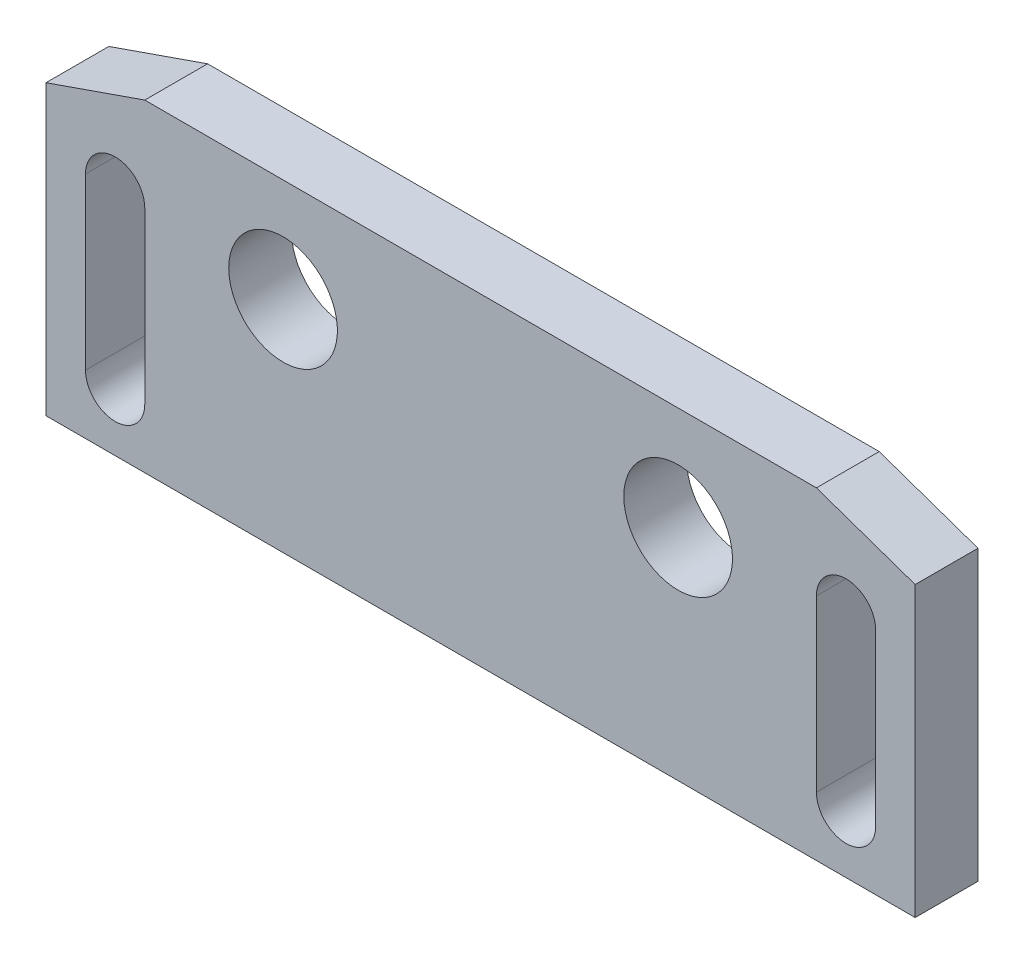
ISO-10303-21;
HEADER;
FILE_DESCRIPTION(('STEP AP214'),'2;1');
FILE_NAME('part.step','',(''),(''),'','','');
FILE_SCHEMA(('AUTOMOTIVE_DESIGN { 1 0 10303 214 1 1 1 1 }'));
ENDSEC;
DATA;
#1=APPLICATION_CONTEXT('core data for automotive mechanical design processes');
#2=APPLICATION_PROTOCOL_DEFINITION('international standard','automotive_design',2000,#1);
#3=PRODUCT_CONTEXT('',#1,'mechanical');
#4=PRODUCT('Part','Part','',(#3));
#5=PRODUCT_RELATED_PRODUCT_CATEGORY('part','',(#4));
#6=PRODUCT_DEFINITION_FORMATION('','',#4);
#7=PRODUCT_DEFINITION_CONTEXT('part definition',#1,'design');
#8=PRODUCT_DEFINITION('design','',#6,#7);
#9=PRODUCT_DEFINITION_SHAPE('','',#8);
#10=(LENGTH_UNIT() NAMED_UNIT(*) SI_UNIT(.MILLI.,.METRE.));
#11=(NAMED_UNIT(*) PLANE_ANGLE_UNIT() SI_UNIT($,.RADIAN.));
#12=(NAMED_UNIT(*) SI_UNIT($,.STERADIAN.) SOLID_ANGLE_UNIT());
#13=UNCERTAINTY_MEASURE_WITH_UNIT(LENGTH_MEASURE(1.E-05),#10,'distance_accuracy_value','');
#14=(GEOMETRIC_REPRESENTATION_CONTEXT(3) GLOBAL_UNCERTAINTY_ASSIGNED_CONTEXT((#13)) GLOBAL_UNIT_ASSIGNED_CONTEXT((#10,
#11,#12)) REPRESENTATION_CONTEXT('',''));
#15=CARTESIAN_POINT('',(0.,0.,0.));
#16=DIRECTION('',(0.,0.,1.));
#17=DIRECTION('',(1.,0.,0.));
#18=AXIS2_PLACEMENT_3D('',#15,#16,#17);
#19=CARTESIAN_POINT('',(0.,0.,3.18));
#20=DIRECTION('',(0.,0.,1.));
#21=DIRECTION('',(1.,0.,0.));
#22=AXIS2_PLACEMENT_3D('',#19,#20,#21);
#23=PLANE('',#22);
#24=CARTESIAN_POINT('',(10.,-15.,3.18));
#25=DIRECTION('',(0.,0.,1.));
#26=DIRECTION('',(1.,0.,0.));
#27=AXIS2_PLACEMENT_3D('',#24,#25,#26);
#28=CIRCLE('',#27,2.75000000000003);
#29=CARTESIAN_POINT('',(7.24999999999997,-15.,3.18));
#30=VERTEX_POINT('',#29);
#31=EDGE_CURVE('E163',#30,#30,#28,.T.);
#32=ORIENTED_EDGE('',*,*,#31,.F.);
#33=EDGE_LOOP('',(#32));
#34=FACE_BOUND('',#33,.T.);
#35=DIRECTION('',(0.,1.,0.));
#36=VECTOR('',#35,1.);
#37=CARTESIAN_POINT('',(-17.,-23.1016190139814,3.18));
#38=LINE('',#37,#36);
#39=CARTESIAN_POINT('',(-17.,-23.1016190139814,3.18));
#40=VERTEX_POINT('',#39);
#41=CARTESIAN_POINT('',(-17.,-14.4983809860214,3.18));
#42=VERTEX_POINT('',#41);
#43=EDGE_CURVE('E175',#40,#42,#38,.T.);
#44=ORIENTED_EDGE('',*,*,#43,.F.);
#45=CARTESIAN_POINT('',(-18.5,-23.1016190139814,3.18));
#46=DIRECTION('',(0.,0.,1.));
#47=DIRECTION('',(1.,0.,0.));
#48=AXIS2_PLACEMENT_3D('',#45,#46,#47);
#49=CIRCLE('',#48,1.5);
#50=CARTESIAN_POINT('',(-20.,-23.1016190139814,3.18));
#51=VERTEX_POINT('',#50);
#52=EDGE_CURVE('E173',#51,#40,#49,.T.);
#53=ORIENTED_EDGE('',*,*,#52,.F.);
#54=DIRECTION('',(0.,-1.,0.));
#55=VECTOR('',#54,1.);
#56=CARTESIAN_POINT('',(-20.,-23.1016190139814,3.18));
#57=LINE('',#56,#55);
#58=CARTESIAN_POINT('',(-20.,-14.4983809860214,3.18));
#59=VERTEX_POINT('',#58);
#60=EDGE_CURVE('E181',#59,#51,#57,.T.);
#61=ORIENTED_EDGE('',*,*,#60,.F.);
#62=CARTESIAN_POINT('',(-18.5,-14.4983809860214,3.18));
#63=DIRECTION('',(0.,0.,1.));
#64=DIRECTION('',(1.,0.,0.));
#65=AXIS2_PLACEMENT_3D('',#62,#63,#64);
#66=CIRCLE('',#65,1.5);
#67=EDGE_CURVE('E178',#42,#59,#66,.T.);
#68=ORIENTED_EDGE('',*,*,#67,.F.);
#69=EDGE_LOOP('',(#44,#53,#61,#68));
#70=FACE_BOUND('',#69,.T.);
#71=DIRECTION('',(-0.944537134510255,-0.328404630800416,0.));
#72=VECTOR('',#71,1.);
#73=CARTESIAN_POINT('',(-17.,-9.76155786362654,3.18));
#74=LINE('',#73,#72);
#75=CARTESIAN_POINT('',(-17.,-9.76155786362654,3.18));
#76=VERTEX_POINT('',#75);
#77=CARTESIAN_POINT('',(-22.,-11.5,3.18));
#78=VERTEX_POINT('',#77);
#79=EDGE_CURVE('E204',#76,#78,#74,.T.);
#80=ORIENTED_EDGE('',*,*,#79,.T.);
#81=DIRECTION('',(0.,-1.,0.));
#82=VECTOR('',#81,1.);
#83=CARTESIAN_POINT('',(-22.,-11.5,3.18));
#84=LINE('',#83,#82);
#85=CARTESIAN_POINT('',(-22.,-26.1016190139814,3.18));
#86=VERTEX_POINT('',#85);
#87=EDGE_CURVE('E207',#78,#86,#84,.T.);
#88=ORIENTED_EDGE('',*,*,#87,.T.);
#89=DIRECTION('',(1.,0.,0.));
#90=VECTOR('',#89,1.);
#91=CARTESIAN_POINT('',(-22.,-26.1016190139814,3.18));
#92=LINE('',#91,#90);
#93=CARTESIAN_POINT('',(22.,-26.1016190139814,3.18));
#94=VERTEX_POINT('',#93);
#95=EDGE_CURVE('E210',#86,#94,#92,.T.);
#96=ORIENTED_EDGE('',*,*,#95,.T.);
#97=DIRECTION('',(0.,1.,0.));
#98=VECTOR('',#97,1.);
#99=CARTESIAN_POINT('',(22.,-11.5,3.18));
#100=LINE('',#99,#98);
#101=CARTESIAN_POINT('',(22.,-11.5,3.18));
#102=VERTEX_POINT('',#101);
#103=EDGE_CURVE('E212',#94,#102,#100,.T.);
#104=ORIENTED_EDGE('',*,*,#103,.T.);
#105=DIRECTION('',(-0.944537134510254,0.328404630800418,0.));
#106=VECTOR('',#105,1.);
#107=CARTESIAN_POINT('',(17.,-9.76155786362654,3.18));
#108=LINE('',#107,#106);
#109=CARTESIAN_POINT('',(17.,-9.76155786362654,3.18));
#110=VERTEX_POINT('',#109);
#111=EDGE_CURVE('E214',#102,#110,#108,.T.);
#112=ORIENTED_EDGE('',*,*,#111,.T.);
#113=DIRECTION('',(-1.,0.,0.));
#114=VECTOR('',#113,1.);
#115=CARTESIAN_POINT('',(-17.,-9.76155786362654,3.18));
#116=LINE('',#115,#114);
#117=EDGE_CURVE('E216',#110,#76,#116,.T.);
#118=ORIENTED_EDGE('',*,*,#117,.T.);
#119=EDGE_LOOP('',(#80,#88,#96,#104,#112,#118));
#120=FACE_BOUND('',#119,.T.);
#121=DIRECTION('',(0.,1.,0.));
#122=VECTOR('',#121,1.);
#123=CARTESIAN_POINT('',(20.,-23.1016190139814,3.18));
#124=LINE('',#123,#122);
#125=CARTESIAN_POINT('',(20.,-23.1016190139814,3.18));
#126=VERTEX_POINT('',#125);
#127=CARTESIAN_POINT('',(20.,-14.4983809860214,3.18));
#128=VERTEX_POINT('',#127);
#129=EDGE_CURVE('E142',#126,#128,#124,.T.);
#130=ORIENTED_EDGE('',*,*,#129,.F.);
#131=CARTESIAN_POINT('',(18.5,-23.1016190139814,3.18));
#132=DIRECTION('',(0.,0.,1.));
#133=DIRECTION('',(-1.,0.,0.));
#134=AXIS2_PLACEMENT_3D('',#131,#132,#133);
#135=CIRCLE('',#134,1.5);
#136=CARTESIAN_POINT('',(17.,-23.1016190139814,3.18));
#137=VERTEX_POINT('',#136);
#138=EDGE_CURVE('E134',#137,#126,#135,.T.);
#139=ORIENTED_EDGE('',*,*,#138,.F.);
#140=DIRECTION('',(0.,-1.,0.));
#141=VECTOR('',#140,1.);
#142=CARTESIAN_POINT('',(17.,-23.1016190139814,3.18));
#143=LINE('',#142,#141);
#144=CARTESIAN_POINT('',(17.,-14.4983809860214,3.18));
#145=VERTEX_POINT('',#144);
#146=EDGE_CURVE('E157',#145,#137,#143,.T.);
#147=ORIENTED_EDGE('',*,*,#146,.F.);
#148=CARTESIAN_POINT('',(18.5,-14.4983809860214,3.18));
#149=DIRECTION('',(0.,0.,1.));
#150=DIRECTION('',(-1.,0.,0.));
#151=AXIS2_PLACEMENT_3D('',#148,#149,#150);
#152=CIRCLE('',#151,1.5);
#153=EDGE_CURVE('E155',#128,#145,#152,.T.);
#154=ORIENTED_EDGE('',*,*,#153,.F.);
#155=EDGE_LOOP('',(#130,#139,#147,#154));
#156=FACE_BOUND('',#155,.T.);
#157=CARTESIAN_POINT('',(-10.,-15.,3.18));
#158=DIRECTION('',(0.,0.,1.));
#159=DIRECTION('',(1.,0.,0.));
#160=AXIS2_PLACEMENT_3D('',#157,#158,#159);
#161=CIRCLE('',#160,2.75000000000003);
#162=CARTESIAN_POINT('',(-12.75,-15.,3.18));
#163=VERTEX_POINT('',#162);
#164=EDGE_CURVE('E328',#163,#163,#161,.T.);
#165=ORIENTED_EDGE('',*,*,#164,.F.);
#166=EDGE_LOOP('',(#165));
#167=FACE_BOUND('',#166,.T.);
#168=ADVANCED_FACE('F33',(#34,#70,#120,#156,#167),#23,.T.);
#169=CARTESIAN_POINT('',(0.,0.,0.));
#170=DIRECTION('',(0.,0.,1.));
#171=DIRECTION('',(1.,0.,0.));
#172=AXIS2_PLACEMENT_3D('',#169,#170,#171);
#173=PLANE('',#172);
#174=CARTESIAN_POINT('',(10.,-15.,0.));
#175=DIRECTION('',(0.,0.,1.));
#176=DIRECTION('',(1.,0.,0.));
#177=AXIS2_PLACEMENT_3D('',#174,#175,#176);
#178=CIRCLE('',#177,2.75000000000003);
#179=CARTESIAN_POINT('',(7.24999999999997,-15.,0.));
#180=VERTEX_POINT('',#179);
#181=EDGE_CURVE('E334',#180,#180,#178,.T.);
#182=ORIENTED_EDGE('',*,*,#181,.T.);
#183=EDGE_LOOP('',(#182));
#184=FACE_BOUND('',#183,.T.);
#185=CARTESIAN_POINT('',(-18.5,-23.1016190139814,0.));
#186=DIRECTION('',(0.,0.,1.));
#187=DIRECTION('',(1.,0.,0.));
#188=AXIS2_PLACEMENT_3D('',#185,#186,#187);
#189=CIRCLE('',#188,1.5);
#190=CARTESIAN_POINT('',(-20.,-23.1016190139814,0.));
#191=VERTEX_POINT('',#190);
#192=CARTESIAN_POINT('',(-17.,-23.1016190139814,0.));
#193=VERTEX_POINT('',#192);
#194=EDGE_CURVE('E150',#191,#193,#189,.T.);
#195=ORIENTED_EDGE('',*,*,#194,.T.);
#196=DIRECTION('',(0.,1.,0.));
#197=VECTOR('',#196,1.);
#198=CARTESIAN_POINT('',(-17.,-23.1016190139814,0.));
#199=LINE('',#198,#197);
#200=CARTESIAN_POINT('',(-17.,-14.4983809860214,0.));
#201=VERTEX_POINT('',#200);
#202=EDGE_CURVE('E186',#193,#201,#199,.T.);
#203=ORIENTED_EDGE('',*,*,#202,.T.);
#204=CARTESIAN_POINT('',(-18.5,-14.4983809860214,0.));
#205=DIRECTION('',(0.,0.,1.));
#206=DIRECTION('',(1.,0.,0.));
#207=AXIS2_PLACEMENT_3D('',#204,#205,#206);
#208=CIRCLE('',#207,1.5);
#209=CARTESIAN_POINT('',(-20.,-14.4983809860214,0.));
#210=VERTEX_POINT('',#209);
#211=EDGE_CURVE('E189',#201,#210,#208,.T.);
#212=ORIENTED_EDGE('',*,*,#211,.T.);
#213=DIRECTION('',(0.,-1.,0.));
#214=VECTOR('',#213,1.);
#215=CARTESIAN_POINT('',(-20.,-23.1016190139814,0.));
#216=LINE('',#215,#214);
#217=EDGE_CURVE('E176',#210,#191,#216,.T.);
#218=ORIENTED_EDGE('',*,*,#217,.T.);
#219=EDGE_LOOP('',(#195,#203,#212,#218));
#220=FACE_BOUND('',#219,.T.);
#221=DIRECTION('',(-0.944537134510255,-0.328404630800416,0.));
#222=VECTOR('',#221,1.);
#223=CARTESIAN_POINT('',(-17.,-9.76155786362654,0.));
#224=LINE('',#223,#222);
#225=CARTESIAN_POINT('',(-17.,-9.76155786362654,0.));
#226=VERTEX_POINT('',#225);
#227=CARTESIAN_POINT('',(-22.,-11.5,0.));
#228=VERTEX_POINT('',#227);
#229=EDGE_CURVE('E203',#226,#228,#224,.T.);
#230=ORIENTED_EDGE('',*,*,#229,.F.);
#231=DIRECTION('',(-1.,0.,0.));
#232=VECTOR('',#231,1.);
#233=CARTESIAN_POINT('',(-17.,-9.76155786362654,0.));
#234=LINE('',#233,#232);
#235=CARTESIAN_POINT('',(17.,-9.76155786362654,0.));
#236=VERTEX_POINT('',#235);
#237=EDGE_CURVE('E208',#236,#226,#234,.T.);
#238=ORIENTED_EDGE('',*,*,#237,.F.);
#239=DIRECTION('',(-0.944537134510254,0.328404630800418,0.));
#240=VECTOR('',#239,1.);
#241=CARTESIAN_POINT('',(17.,-9.76155786362654,0.));
#242=LINE('',#241,#240);
#243=CARTESIAN_POINT('',(22.,-11.5,0.));
#244=VERTEX_POINT('',#243);
#245=EDGE_CURVE('E227',#244,#236,#242,.T.);
#246=ORIENTED_EDGE('',*,*,#245,.F.);
#247=DIRECTION('',(0.,1.,0.));
#248=VECTOR('',#247,1.);
#249=CARTESIAN_POINT('',(22.,-11.5,0.));
#250=LINE('',#249,#248);
#251=CARTESIAN_POINT('',(22.,-26.1016190139814,0.));
#252=VERTEX_POINT('',#251);
#253=EDGE_CURVE('E225',#252,#244,#250,.T.);
#254=ORIENTED_EDGE('',*,*,#253,.F.);
#255=DIRECTION('',(1.,0.,0.));
#256=VECTOR('',#255,1.);
#257=CARTESIAN_POINT('',(-22.,-26.1016190139814,0.));
#258=LINE('',#257,#256);
#259=CARTESIAN_POINT('',(-22.,-26.1016190139814,0.));
#260=VERTEX_POINT('',#259);
#261=EDGE_CURVE('E223',#260,#252,#258,.T.);
#262=ORIENTED_EDGE('',*,*,#261,.F.);
#263=DIRECTION('',(0.,-1.,0.));
#264=VECTOR('',#263,1.);
#265=CARTESIAN_POINT('',(-22.,-11.5,0.));
#266=LINE('',#265,#264);
#267=EDGE_CURVE('E221',#228,#260,#266,.T.);
#268=ORIENTED_EDGE('',*,*,#267,.F.);
#269=EDGE_LOOP('',(#230,#238,#246,#254,#262,#268));
#270=FACE_BOUND('',#269,.T.);
#271=CARTESIAN_POINT('',(18.5,-23.1016190139814,0.));
#272=DIRECTION('',(0.,0.,1.));
#273=DIRECTION('',(-1.,0.,0.));
#274=AXIS2_PLACEMENT_3D('',#271,#272,#273);
#275=CIRCLE('',#274,1.5);
#276=CARTESIAN_POINT('',(17.,-23.1016190139814,0.));
#277=VERTEX_POINT('',#276);
#278=CARTESIAN_POINT('',(20.,-23.1016190139814,0.));
#279=VERTEX_POINT('',#278);
#280=EDGE_CURVE('E56',#277,#279,#275,.T.);
#281=ORIENTED_EDGE('',*,*,#280,.T.);
#282=DIRECTION('',(0.,1.,0.));
#283=VECTOR('',#282,1.);
#284=CARTESIAN_POINT('',(20.,-23.1016190139814,0.));
#285=LINE('',#284,#283);
#286=CARTESIAN_POINT('',(20.,-14.4983809860214,0.));
#287=VERTEX_POINT('',#286);
#288=EDGE_CURVE('E149',#279,#287,#285,.T.);
#289=ORIENTED_EDGE('',*,*,#288,.T.);
#290=CARTESIAN_POINT('',(18.5,-14.4983809860214,0.));
#291=DIRECTION('',(0.,0.,1.));
#292=DIRECTION('',(-1.,0.,0.));
#293=AXIS2_PLACEMENT_3D('',#290,#291,#292);
#294=CIRCLE('',#293,1.5);
#295=CARTESIAN_POINT('',(17.,-14.4983809860214,0.));
#296=VERTEX_POINT('',#295);
#297=EDGE_CURVE('E165',#287,#296,#294,.T.);
#298=ORIENTED_EDGE('',*,*,#297,.T.);
#299=DIRECTION('',(0.,-1.,0.));
#300=VECTOR('',#299,1.);
#301=CARTESIAN_POINT('',(17.,-23.1016190139814,0.));
#302=LINE('',#301,#300);
#303=EDGE_CURVE('E143',#296,#277,#302,.T.);
#304=ORIENTED_EDGE('',*,*,#303,.T.);
#305=EDGE_LOOP('',(#281,#289,#298,#304));
#306=FACE_BOUND('',#305,.T.);
#307=CARTESIAN_POINT('',(-10.,-15.,0.));
#308=DIRECTION('',(0.,0.,1.));
#309=DIRECTION('',(1.,0.,0.));
#310=AXIS2_PLACEMENT_3D('',#307,#308,#309);
#311=CIRCLE('',#310,2.75000000000003);
#312=CARTESIAN_POINT('',(-12.75,-15.,0.));
#313=VERTEX_POINT('',#312);
#314=EDGE_CURVE('E331',#313,#313,#311,.T.);
#315=ORIENTED_EDGE('',*,*,#314,.T.);
#316=EDGE_LOOP('',(#315));
#317=FACE_BOUND('',#316,.T.);
#318=ADVANCED_FACE('F251',(#184,#220,#270,#306,#317),#173,.F.);
#319=CARTESIAN_POINT('',(-17.,-9.76155786362654,3.18));
#320=DIRECTION('',(0.328404630800416,-0.944537134510254,0.));
#321=DIRECTION('',(0.944537134510255,0.328404630800416,0.));
#322=AXIS2_PLACEMENT_3D('',#319,#320,#321);
#323=PLANE('',#322);
#324=ORIENTED_EDGE('',*,*,#229,.T.);
#325=DIRECTION('',(0.,0.,-1.));
#326=VECTOR('',#325,1.);
#327=CARTESIAN_POINT('',(-22.,-11.5,3.18));
#328=LINE('',#327,#326);
#329=EDGE_CURVE('E11',#78,#228,#328,.T.);
#330=ORIENTED_EDGE('',*,*,#329,.F.);
#331=ORIENTED_EDGE('',*,*,#79,.F.);
#332=DIRECTION('',(0.,0.,-1.));
#333=VECTOR('',#332,1.);
#334=CARTESIAN_POINT('',(-17.,-9.76155786362654,3.18));
#335=LINE('',#334,#333);
#336=EDGE_CURVE('E218',#76,#226,#335,.T.);
#337=ORIENTED_EDGE('',*,*,#336,.T.);
#338=EDGE_LOOP('',(#324,#330,#331,#337));
#339=FACE_BOUND('',#338,.T.);
#340=ADVANCED_FACE('F35',(#339),#323,.F.);
#341=CARTESIAN_POINT('',(-22.,-11.5,3.18));
#342=DIRECTION('',(1.,0.,0.));
#343=DIRECTION('',(0.,0.,-1.));
#344=AXIS2_PLACEMENT_3D('',#341,#342,#343);
#345=PLANE('',#344);
#346=ORIENTED_EDGE('',*,*,#267,.T.);
#347=DIRECTION('',(0.,0.,-1.));
#348=VECTOR('',#347,1.);
#349=CARTESIAN_POINT('',(-22.,-26.1016190139814,3.18));
#350=LINE('',#349,#348);
#351=EDGE_CURVE('E41',#86,#260,#350,.T.);
#352=ORIENTED_EDGE('',*,*,#351,.F.);
#353=ORIENTED_EDGE('',*,*,#87,.F.);
#354=ORIENTED_EDGE('',*,*,#329,.T.);
#355=EDGE_LOOP('',(#346,#352,#353,#354));
#356=FACE_BOUND('',#355,.T.);
#357=ADVANCED_FACE('F268',(#356),#345,.F.);
#358=CARTESIAN_POINT('',(-22.,-26.1016190139814,3.18));
#359=DIRECTION('',(0.,1.,0.));
#360=DIRECTION('',(-1.,0.,0.));
#361=AXIS2_PLACEMENT_3D('',#358,#359,#360);
#362=PLANE('',#361);
#363=ORIENTED_EDGE('',*,*,#261,.T.);
#364=DIRECTION('',(0.,0.,-1.));
#365=VECTOR('',#364,1.);
#366=CARTESIAN_POINT('',(22.,-26.1016190139814,3.18));
#367=LINE('',#366,#365);
#368=EDGE_CURVE('E238',#94,#252,#367,.T.);
#369=ORIENTED_EDGE('',*,*,#368,.F.);
#370=ORIENTED_EDGE('',*,*,#95,.F.);
#371=ORIENTED_EDGE('',*,*,#351,.T.);
#372=EDGE_LOOP('',(#363,#369,#370,#371));
#373=FACE_BOUND('',#372,.T.);
#374=ADVANCED_FACE('F245',(#373),#362,.F.);
#375=CARTESIAN_POINT('',(22.,-11.5,3.18));
#376=DIRECTION('',(-1.,0.,0.));
#377=DIRECTION('',(0.,-1.,0.));
#378=AXIS2_PLACEMENT_3D('',#375,#376,#377);
#379=PLANE('',#378);
#380=ORIENTED_EDGE('',*,*,#253,.T.);
#381=DIRECTION('',(0.,0.,-1.));
#382=VECTOR('',#381,1.);
#383=CARTESIAN_POINT('',(22.,-11.5,3.18));
#384=LINE('',#383,#382);
#385=EDGE_CURVE('E235',#102,#244,#384,.T.);
#386=ORIENTED_EDGE('',*,*,#385,.F.);
#387=ORIENTED_EDGE('',*,*,#103,.F.);
#388=ORIENTED_EDGE('',*,*,#368,.T.);
#389=EDGE_LOOP('',(#380,#386,#387,#388));
#390=FACE_BOUND('',#389,.T.);
#391=ADVANCED_FACE('F257',(#390),#379,.F.);
#392=CARTESIAN_POINT('',(17.,-9.76155786362654,3.18));
#393=DIRECTION('',(-0.328404630800418,-0.944537134510254,0.));
#394=DIRECTION('',(0.944537134510254,-0.328404630800418,0.));
#395=AXIS2_PLACEMENT_3D('',#392,#393,#394);
#396=PLANE('',#395);
#397=ORIENTED_EDGE('',*,*,#245,.T.);
#398=DIRECTION('',(0.,0.,-1.));
#399=VECTOR('',#398,1.);
#400=CARTESIAN_POINT('',(17.,-9.76155786362654,3.18));
#401=LINE('',#400,#399);
#402=EDGE_CURVE('E232',#110,#236,#401,.T.);
#403=ORIENTED_EDGE('',*,*,#402,.F.);
#404=ORIENTED_EDGE('',*,*,#111,.F.);
#405=ORIENTED_EDGE('',*,*,#385,.T.);
#406=EDGE_LOOP('',(#397,#403,#404,#405));
#407=FACE_BOUND('',#406,.T.);
#408=ADVANCED_FACE('F261',(#407),#396,.F.);
#409=CARTESIAN_POINT('',(-17.,-9.76155786362654,3.18));
#410=DIRECTION('',(0.,-1.,0.));
#411=DIRECTION('',(0.,0.,-1.));
#412=AXIS2_PLACEMENT_3D('',#409,#410,#411);
#413=PLANE('',#412);
#414=ORIENTED_EDGE('',*,*,#237,.T.);
#415=ORIENTED_EDGE('',*,*,#336,.F.);
#416=ORIENTED_EDGE('',*,*,#117,.F.);
#417=ORIENTED_EDGE('',*,*,#402,.T.);
#418=EDGE_LOOP('',(#414,#415,#416,#417));
#419=FACE_BOUND('',#418,.T.);
#420=ADVANCED_FACE('F271',(#419),#413,.F.);
#421=CARTESIAN_POINT('',(-18.5,-23.1016190139814,3.18));
#422=DIRECTION('',(0.,0.,-1.));
#423=DIRECTION('',(-1.,0.,0.));
#424=AXIS2_PLACEMENT_3D('',#421,#422,#423);
#425=CYLINDRICAL_SURFACE('',#424,1.5);
#426=ORIENTED_EDGE('',*,*,#194,.F.);
#427=DIRECTION('',(0.,0.,-1.));
#428=VECTOR('',#427,1.);
#429=CARTESIAN_POINT('',(-20.,-23.1016190139814,3.18));
#430=LINE('',#429,#428);
#431=EDGE_CURVE('E183',#51,#191,#430,.T.);
#432=ORIENTED_EDGE('',*,*,#431,.F.);
#433=ORIENTED_EDGE('',*,*,#52,.T.);
#434=DIRECTION('',(0.,0.,-1.));
#435=VECTOR('',#434,1.);
#436=CARTESIAN_POINT('',(-17.,-23.1016190139814,3.18));
#437=LINE('',#436,#435);
#438=EDGE_CURVE('E200',#40,#193,#437,.T.);
#439=ORIENTED_EDGE('',*,*,#438,.T.);
#440=EDGE_LOOP('',(#426,#432,#433,#439));
#441=FACE_BOUND('',#440,.T.);
#442=ADVANCED_FACE('F273',(#441),#425,.F.);
#443=CARTESIAN_POINT('',(-17.,-23.1016190139814,3.18));
#444=DIRECTION('',(-1.,0.,0.));
#445=DIRECTION('',(0.,-1.,0.));
#446=AXIS2_PLACEMENT_3D('',#443,#444,#445);
#447=PLANE('',#446);
#448=ORIENTED_EDGE('',*,*,#202,.F.);
#449=ORIENTED_EDGE('',*,*,#438,.F.);
#450=ORIENTED_EDGE('',*,*,#43,.T.);
#451=DIRECTION('',(0.,0.,-1.));
#452=VECTOR('',#451,1.);
#453=CARTESIAN_POINT('',(-17.,-14.4983809860214,3.18));
#454=LINE('',#453,#452);
#455=EDGE_CURVE('E198',#42,#201,#454,.T.);
#456=ORIENTED_EDGE('',*,*,#455,.T.);
#457=EDGE_LOOP('',(#448,#449,#450,#456));
#458=FACE_BOUND('',#457,.T.);
#459=ADVANCED_FACE('F279',(#458),#447,.T.);
#460=CARTESIAN_POINT('',(-18.5,-14.4983809860214,3.18));
#461=DIRECTION('',(0.,0.,-1.));
#462=DIRECTION('',(-1.,0.,0.));
#463=AXIS2_PLACEMENT_3D('',#460,#461,#462);
#464=CYLINDRICAL_SURFACE('',#463,1.5);
#465=ORIENTED_EDGE('',*,*,#211,.F.);
#466=ORIENTED_EDGE('',*,*,#455,.F.);
#467=ORIENTED_EDGE('',*,*,#67,.T.);
#468=DIRECTION('',(0.,0.,-1.));
#469=VECTOR('',#468,1.);
#470=CARTESIAN_POINT('',(-20.,-14.4983809860214,3.18));
#471=LINE('',#470,#469);
#472=EDGE_CURVE('E196',#59,#210,#471,.T.);
#473=ORIENTED_EDGE('',*,*,#472,.T.);
#474=EDGE_LOOP('',(#465,#466,#467,#473));
#475=FACE_BOUND('',#474,.T.);
#476=ADVANCED_FACE('F296',(#475),#464,.F.);
#477=CARTESIAN_POINT('',(-20.,-23.1016190139814,3.18));
#478=DIRECTION('',(1.,0.,0.));
#479=DIRECTION('',(0.,0.,-1.));
#480=AXIS2_PLACEMENT_3D('',#477,#478,#479);
#481=PLANE('',#480);
#482=ORIENTED_EDGE('',*,*,#217,.F.);
#483=ORIENTED_EDGE('',*,*,#472,.F.);
#484=ORIENTED_EDGE('',*,*,#60,.T.);
#485=ORIENTED_EDGE('',*,*,#431,.T.);
#486=EDGE_LOOP('',(#482,#483,#484,#485));
#487=FACE_BOUND('',#486,.T.);
#488=ADVANCED_FACE('F300',(#487),#481,.T.);
#489=CARTESIAN_POINT('',(18.5,-23.1016190139814,3.18));
#490=DIRECTION('',(0.,0.,-1.));
#491=DIRECTION('',(-1.,0.,0.));
#492=AXIS2_PLACEMENT_3D('',#489,#490,#491);
#493=CYLINDRICAL_SURFACE('',#492,1.5);
#494=ORIENTED_EDGE('',*,*,#280,.F.);
#495=DIRECTION('',(0.,0.,-1.));
#496=VECTOR('',#495,1.);
#497=CARTESIAN_POINT('',(17.,-23.1016190139814,3.18));
#498=LINE('',#497,#496);
#499=EDGE_CURVE('E138',#137,#277,#498,.T.);
#500=ORIENTED_EDGE('',*,*,#499,.F.);
#501=ORIENTED_EDGE('',*,*,#138,.T.);
#502=DIRECTION('',(0.,0.,-1.));
#503=VECTOR('',#502,1.);
#504=CARTESIAN_POINT('',(20.,-23.1016190139814,3.18));
#505=LINE('',#504,#503);
#506=EDGE_CURVE('E137',#126,#279,#505,.T.);
#507=ORIENTED_EDGE('',*,*,#506,.T.);
#508=EDGE_LOOP('',(#494,#500,#501,#507));
#509=FACE_BOUND('',#508,.T.);
#510=ADVANCED_FACE('F136',(#509),#493,.F.);
#511=CARTESIAN_POINT('',(20.,-23.1016190139814,3.18));
#512=DIRECTION('',(-1.,0.,0.));
#513=DIRECTION('',(0.,-1.,0.));
#514=AXIS2_PLACEMENT_3D('',#511,#512,#513);
#515=PLANE('',#514);
#516=ORIENTED_EDGE('',*,*,#288,.F.);
#517=ORIENTED_EDGE('',*,*,#506,.F.);
#518=ORIENTED_EDGE('',*,*,#129,.T.);
#519=DIRECTION('',(0.,0.,-1.));
#520=VECTOR('',#519,1.);
#521=CARTESIAN_POINT('',(20.,-14.4983809860214,3.18));
#522=LINE('',#521,#520);
#523=EDGE_CURVE('E151',#128,#287,#522,.T.);
#524=ORIENTED_EDGE('',*,*,#523,.T.);
#525=EDGE_LOOP('',(#516,#517,#518,#524));
#526=FACE_BOUND('',#525,.T.);
#527=ADVANCED_FACE('F146',(#526),#515,.T.);
#528=CARTESIAN_POINT('',(18.5,-14.4983809860214,3.18));
#529=DIRECTION('',(0.,0.,-1.));
#530=DIRECTION('',(-1.,0.,0.));
#531=AXIS2_PLACEMENT_3D('',#528,#529,#530);
#532=CYLINDRICAL_SURFACE('',#531,1.5);
#533=ORIENTED_EDGE('',*,*,#297,.F.);
#534=ORIENTED_EDGE('',*,*,#523,.F.);
#535=ORIENTED_EDGE('',*,*,#153,.T.);
#536=DIRECTION('',(0.,0.,-1.));
#537=VECTOR('',#536,1.);
#538=CARTESIAN_POINT('',(17.,-14.4983809860214,3.18));
#539=LINE('',#538,#537);
#540=EDGE_CURVE('E48',#145,#296,#539,.T.);
#541=ORIENTED_EDGE('',*,*,#540,.T.);
#542=EDGE_LOOP('',(#533,#534,#535,#541));
#543=FACE_BOUND('',#542,.T.);
#544=ADVANCED_FACE('F309',(#543),#532,.F.);
#545=CARTESIAN_POINT('',(17.,-23.1016190139814,3.18));
#546=DIRECTION('',(1.,0.,0.));
#547=DIRECTION('',(0.,1.,0.));
#548=AXIS2_PLACEMENT_3D('',#545,#546,#547);
#549=PLANE('',#548);
#550=ORIENTED_EDGE('',*,*,#303,.F.);
#551=ORIENTED_EDGE('',*,*,#540,.F.);
#552=ORIENTED_EDGE('',*,*,#146,.T.);
#553=ORIENTED_EDGE('',*,*,#499,.T.);
#554=EDGE_LOOP('',(#550,#551,#552,#553));
#555=FACE_BOUND('',#554,.T.);
#556=ADVANCED_FACE('F312',(#555),#549,.T.);
#557=CARTESIAN_POINT('',(10.,-15.,3.18));
#558=DIRECTION('',(0.,0.,-1.));
#559=DIRECTION('',(-1.,0.,0.));
#560=AXIS2_PLACEMENT_3D('',#557,#558,#559);
#561=CYLINDRICAL_SURFACE('',#560,2.75000000000003);
#562=CARTESIAN_POINT('',(7.24999999999997,-15.,3.18));
#563=CARTESIAN_POINT('',(7.24999999999997,-15.,3.146875));
#564=CARTESIAN_POINT('',(7.24999999999997,-15.,3.11375));
#565=CARTESIAN_POINT('',(7.24999999999997,-15.,3.0475));
#566=CARTESIAN_POINT('',(7.24999999999997,-15.,3.014375));
#567=CARTESIAN_POINT('',(7.24999999999997,-15.,2.948125));
#568=CARTESIAN_POINT('',(7.24999999999997,-15.,2.915));
#569=CARTESIAN_POINT('',(7.24999999999997,-15.,2.84875));
#570=CARTESIAN_POINT('',(7.24999999999997,-15.,2.815625));
#571=CARTESIAN_POINT('',(7.24999999999997,-15.,2.749375));
#572=CARTESIAN_POINT('',(7.24999999999997,-15.,2.71625));
#573=CARTESIAN_POINT('',(7.24999999999997,-15.,2.65));
#574=CARTESIAN_POINT('',(7.24999999999997,-15.,2.616875));
#575=CARTESIAN_POINT('',(7.24999999999997,-15.,2.550625));
#576=CARTESIAN_POINT('',(7.24999999999997,-15.,2.5175));
#577=CARTESIAN_POINT('',(7.24999999999997,-15.,2.45125));
#578=CARTESIAN_POINT('',(7.24999999999997,-15.,2.418125));
#579=CARTESIAN_POINT('',(7.24999999999997,-15.,2.351875));
#580=CARTESIAN_POINT('',(7.24999999999997,-15.,2.31875));
#581=CARTESIAN_POINT('',(7.24999999999997,-15.,2.2525));
#582=CARTESIAN_POINT('',(7.24999999999997,-15.,2.219375));
#583=CARTESIAN_POINT('',(7.24999999999997,-15.,2.153125));
#584=CARTESIAN_POINT('',(7.24999999999997,-15.,2.12));
#585=CARTESIAN_POINT('',(7.24999999999997,-15.,2.05375));
#586=CARTESIAN_POINT('',(7.24999999999997,-15.,2.020625));
#587=CARTESIAN_POINT('',(7.24999999999997,-15.,1.954375));
#588=CARTESIAN_POINT('',(7.24999999999997,-15.,1.92125));
#589=CARTESIAN_POINT('',(7.24999999999997,-15.,1.855));
#590=CARTESIAN_POINT('',(7.24999999999997,-15.,1.821875));
#591=CARTESIAN_POINT('',(7.24999999999997,-15.,1.755625));
#592=CARTESIAN_POINT('',(7.24999999999997,-15.,1.7225));
#593=CARTESIAN_POINT('',(7.24999999999997,-15.,1.65625));
#594=CARTESIAN_POINT('',(7.24999999999997,-15.,1.623125));
#595=CARTESIAN_POINT('',(7.24999999999997,-15.,1.556875));
#596=CARTESIAN_POINT('',(7.24999999999997,-15.,1.52375));
#597=CARTESIAN_POINT('',(7.24999999999997,-15.,1.4575));
#598=CARTESIAN_POINT('',(7.24999999999997,-15.,1.424375));
#599=CARTESIAN_POINT('',(7.24999999999997,-15.,1.358125));
#600=CARTESIAN_POINT('',(7.24999999999997,-15.,1.325));
#601=CARTESIAN_POINT('',(7.24999999999997,-15.,1.25875));
#602=CARTESIAN_POINT('',(7.24999999999997,-15.,1.225625));
#603=CARTESIAN_POINT('',(7.24999999999997,-15.,1.159375));
#604=CARTESIAN_POINT('',(7.24999999999997,-15.,1.12625));
#605=CARTESIAN_POINT('',(7.24999999999997,-15.,1.06));
#606=CARTESIAN_POINT('',(7.24999999999997,-15.,1.026875));
#607=CARTESIAN_POINT('',(7.24999999999997,-15.,0.960625));
#608=CARTESIAN_POINT('',(7.24999999999997,-15.,0.9275));
#609=CARTESIAN_POINT('',(7.24999999999997,-15.,0.86125));
#610=CARTESIAN_POINT('',(7.24999999999997,-15.,0.828125));
#611=CARTESIAN_POINT('',(7.24999999999997,-15.,0.761875));
#612=CARTESIAN_POINT('',(7.24999999999997,-15.,0.72875));
#613=CARTESIAN_POINT('',(7.24999999999997,-15.,0.6625));
#614=CARTESIAN_POINT('',(7.24999999999997,-15.,0.629375));
#615=CARTESIAN_POINT('',(7.24999999999997,-15.,0.563125));
#616=CARTESIAN_POINT('',(7.24999999999997,-15.,0.53));
#617=CARTESIAN_POINT('',(7.24999999999997,-15.,0.46375));
#618=CARTESIAN_POINT('',(7.24999999999997,-15.,0.430625));
#619=CARTESIAN_POINT('',(7.24999999999997,-15.,0.364375));
#620=CARTESIAN_POINT('',(7.24999999999997,-15.,0.33125));
#621=CARTESIAN_POINT('',(7.24999999999997,-15.,0.265));
#622=CARTESIAN_POINT('',(7.24999999999997,-15.,0.231875));
#623=CARTESIAN_POINT('',(7.24999999999997,-15.,0.165625));
#624=CARTESIAN_POINT('',(7.24999999999997,-15.,0.1325));
#625=CARTESIAN_POINT('',(7.24999999999997,-15.,0.06625));
#626=CARTESIAN_POINT('',(7.24999999999997,-15.,0.033125));
#627=CARTESIAN_POINT('',(7.24999999999997,-15.,0.));
#628=B_SPLINE_CURVE_WITH_KNOTS('',3,(#562,#563,#564,#565,#566,#567,#568,#569,#570,#571,#572,
#573,#574,#575,#576,#577,#578,#579,#580,#581,#582,#583,#584,#585,#586,#587,#588,#589,#590,#591,
#592,#593,#594,#595,#596,#597,#598,#599,#600,#601,#602,#603,#604,#605,#606,#607,#608,#609,#610,
#611,#612,#613,#614,#615,#616,#617,#618,#619,#620,#621,#622,#623,#624,#625,#626,#627),
.UNSPECIFIED.,.F.,.F.,(4,2,2,2,2,2,2,2,2,2,2,2,2,2,2,2,2,2,2,2,2,2,2,2,2,2,2,2,2,2,2,2,4),(0.,
0.0993750000000001,0.19875,0.298125,0.3975,0.496875,0.59625,0.695625,0.795,0.894375,0.99375,
1.093125,1.1925,1.291875,1.39125,1.490625,1.59,1.689375,1.78875,1.888125,1.9875,2.086875,
2.18625,2.285625,2.385,2.484375,2.58375,2.683125,2.7825,2.881875,2.98125,3.080625,3.18),.UNSPECIFIED.);
#629=EDGE_CURVE('BSEAM316',#30,#180,#628,.T.);
#630=ORIENTED_EDGE('',*,*,#31,.T.);
#631=ORIENTED_EDGE('',*,*,#181,.F.);
#632=ORIENTED_EDGE('',*,*,#629,.T.);
#633=ORIENTED_EDGE('',*,*,#629,.F.);
#634=EDGE_LOOP('',(#630,#632,#631,#633));
#635=FACE_BOUND('',#634,.T.);
#636=ADVANCED_FACE('F316',(#635),#561,.F.);
#637=CARTESIAN_POINT('',(-10.,-15.,3.18));
#638=DIRECTION('',(0.,0.,-1.));
#639=DIRECTION('',(-1.,0.,0.));
#640=AXIS2_PLACEMENT_3D('',#637,#638,#639);
#641=CYLINDRICAL_SURFACE('',#640,2.75000000000003);
#642=CARTESIAN_POINT('',(-12.75,-15.,3.18));
#643=CARTESIAN_POINT('',(-12.75,-15.,3.146875));
#644=CARTESIAN_POINT('',(-12.75,-15.,3.11375));
#645=CARTESIAN_POINT('',(-12.75,-15.,3.0475));
#646=CARTESIAN_POINT('',(-12.75,-15.,3.014375));
#647=CARTESIAN_POINT('',(-12.75,-15.,2.948125));
#648=CARTESIAN_POINT('',(-12.75,-15.,2.915));
#649=CARTESIAN_POINT('',(-12.75,-15.,2.84875));
#650=CARTESIAN_POINT('',(-12.75,-15.,2.815625));
#651=CARTESIAN_POINT('',(-12.75,-15.,2.749375));
#652=CARTESIAN_POINT('',(-12.75,-15.,2.71625));
#653=CARTESIAN_POINT('',(-12.75,-15.,2.65));
#654=CARTESIAN_POINT('',(-12.75,-15.,2.616875));
#655=CARTESIAN_POINT('',(-12.75,-15.,2.550625));
#656=CARTESIAN_POINT('',(-12.75,-15.,2.5175));
#657=CARTESIAN_POINT('',(-12.75,-15.,2.45125));
#658=CARTESIAN_POINT('',(-12.75,-15.,2.418125));
#659=CARTESIAN_POINT('',(-12.75,-15.,2.351875));
#660=CARTESIAN_POINT('',(-12.75,-15.,2.31875));
#661=CARTESIAN_POINT('',(-12.75,-15.,2.2525));
#662=CARTESIAN_POINT('',(-12.75,-15.,2.219375));
#663=CARTESIAN_POINT('',(-12.75,-15.,2.153125));
#664=CARTESIAN_POINT('',(-12.75,-15.,2.12));
#665=CARTESIAN_POINT('',(-12.75,-15.,2.05375));
#666=CARTESIAN_POINT('',(-12.75,-15.,2.020625));
#667=CARTESIAN_POINT('',(-12.75,-15.,1.954375));
#668=CARTESIAN_POINT('',(-12.75,-15.,1.92125));
#669=CARTESIAN_POINT('',(-12.75,-15.,1.855));
#670=CARTESIAN_POINT('',(-12.75,-15.,1.821875));
#671=CARTESIAN_POINT('',(-12.75,-15.,1.755625));
#672=CARTESIAN_POINT('',(-12.75,-15.,1.7225));
#673=CARTESIAN_POINT('',(-12.75,-15.,1.65625));
#674=CARTESIAN_POINT('',(-12.75,-15.,1.623125));
#675=CARTESIAN_POINT('',(-12.75,-15.,1.556875));
#676=CARTESIAN_POINT('',(-12.75,-15.,1.52375));
#677=CARTESIAN_POINT('',(-12.75,-15.,1.4575));
#678=CARTESIAN_POINT('',(-12.75,-15.,1.424375));
#679=CARTESIAN_POINT('',(-12.75,-15.,1.358125));
#680=CARTESIAN_POINT('',(-12.75,-15.,1.325));
#681=CARTESIAN_POINT('',(-12.75,-15.,1.25875));
#682=CARTESIAN_POINT('',(-12.75,-15.,1.225625));
#683=CARTESIAN_POINT('',(-12.75,-15.,1.159375));
#684=CARTESIAN_POINT('',(-12.75,-15.,1.12625));
#685=CARTESIAN_POINT('',(-12.75,-15.,1.06));
#686=CARTESIAN_POINT('',(-12.75,-15.,1.026875));
#687=CARTESIAN_POINT('',(-12.75,-15.,0.960625));
#688=CARTESIAN_POINT('',(-12.75,-15.,0.9275));
#689=CARTESIAN_POINT('',(-12.75,-15.,0.86125));
#690=CARTESIAN_POINT('',(-12.75,-15.,0.828125));
#691=CARTESIAN_POINT('',(-12.75,-15.,0.761875));
#692=CARTESIAN_POINT('',(-12.75,-15.,0.72875));
#693=CARTESIAN_POINT('',(-12.75,-15.,0.6625));
#694=CARTESIAN_POINT('',(-12.75,-15.,0.629375));
#695=CARTESIAN_POINT('',(-12.75,-15.,0.563125));
#696=CARTESIAN_POINT('',(-12.75,-15.,0.53));
#697=CARTESIAN_POINT('',(-12.75,-15.,0.46375));
#698=CARTESIAN_POINT('',(-12.75,-15.,0.430625));
#699=CARTESIAN_POINT('',(-12.75,-15.,0.364375));
#700=CARTESIAN_POINT('',(-12.75,-15.,0.33125));
#701=CARTESIAN_POINT('',(-12.75,-15.,0.265));
#702=CARTESIAN_POINT('',(-12.75,-15.,0.231875));
#703=CARTESIAN_POINT('',(-12.75,-15.,0.165625));
#704=CARTESIAN_POINT('',(-12.75,-15.,0.1325));
#705=CARTESIAN_POINT('',(-12.75,-15.,0.06625));
#706=CARTESIAN_POINT('',(-12.75,-15.,0.033125));
#707=CARTESIAN_POINT('',(-12.75,-15.,0.));
#708=B_SPLINE_CURVE_WITH_KNOTS('',3,(#642,#643,#644,#645,#646,#647,#648,#649,#650,#651,#652,
#653,#654,#655,#656,#657,#658,#659,#660,#661,#662,#663,#664,#665,#666,#667,#668,#669,#670,#671,
#672,#673,#674,#675,#676,#677,#678,#679,#680,#681,#682,#683,#684,#685,#686,#687,#688,#689,#690,
#691,#692,#693,#694,#695,#696,#697,#698,#699,#700,#701,#702,#703,#704,#705,#706,#707),
.UNSPECIFIED.,.F.,.F.,(4,2,2,2,2,2,2,2,2,2,2,2,2,2,2,2,2,2,2,2,2,2,2,2,2,2,2,2,2,2,2,2,4),(0.,
0.0993750000000001,0.19875,0.298125,0.3975,0.496875,0.59625,0.695625,0.795,0.894375,0.99375,
1.093125,1.1925,1.291875,1.39125,1.490625,1.59,1.689375,1.78875,1.888125,1.9875,2.086875,
2.18625,2.285625,2.385,2.484375,2.58375,2.683125,2.7825,2.881875,2.98125,3.080625,3.18),.UNSPECIFIED.);
#709=EDGE_CURVE('BSEAM319',#163,#313,#708,.T.);
#710=ORIENTED_EDGE('',*,*,#164,.T.);
#711=ORIENTED_EDGE('',*,*,#314,.F.);
#712=ORIENTED_EDGE('',*,*,#709,.T.);
#713=ORIENTED_EDGE('',*,*,#709,.F.);
#714=EDGE_LOOP('',(#710,#712,#711,#713));
#715=FACE_BOUND('',#714,.T.);
#716=ADVANCED_FACE('F319',(#715),#641,.F.);
#717=CLOSED_SHELL('',(#168,#318,#340,#357,#374,#391,#408,#420,#442,#459,#476,#488,#510,#527,
#544,#556,#636,#716));
#718=MANIFOLD_SOLID_BREP('B2',#717);
#719=ADVANCED_BREP_SHAPE_REPRESENTATION('',(#18,#718),#14);
#720=SHAPE_DEFINITION_REPRESENTATION(#9,#719);
ENDSEC;
END-ISO-10303-21;
